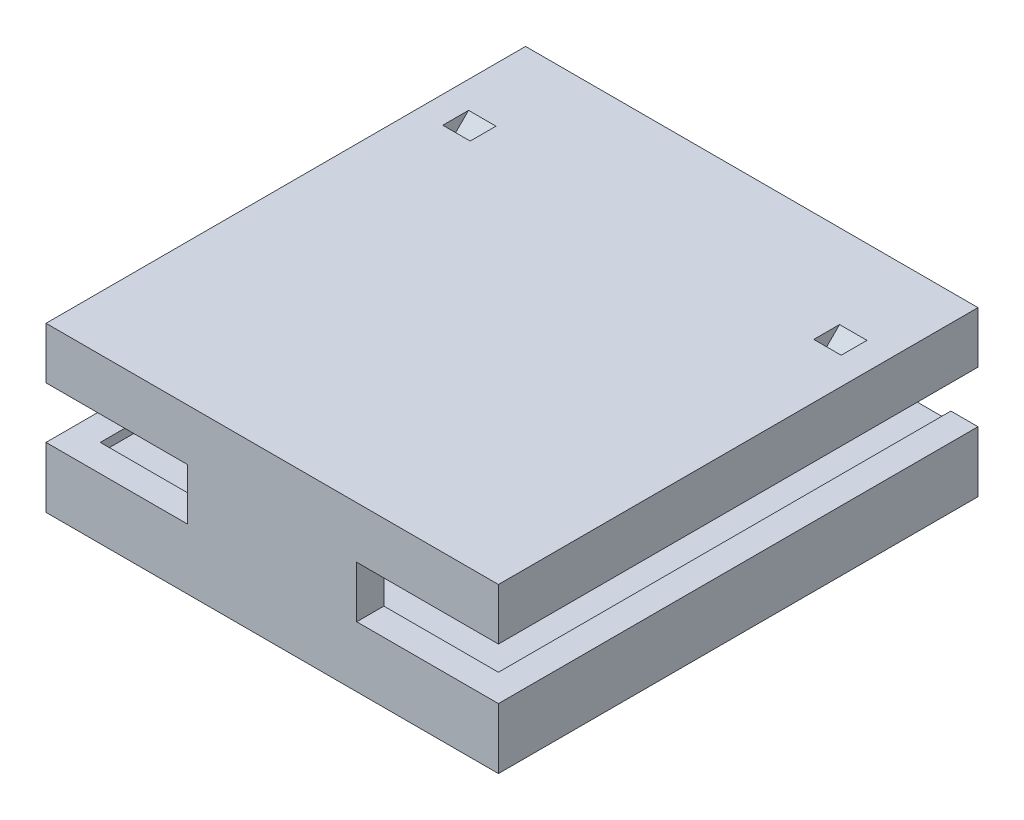
ISO-10303-21;
HEADER;
FILE_DESCRIPTION(('STEP AP214'),'2;1');
FILE_NAME('part.step','',(''),(''),'','','');
FILE_SCHEMA(('AUTOMOTIVE_DESIGN { 1 0 10303 214 1 1 1 1 }'));
ENDSEC;
DATA;
#1=APPLICATION_CONTEXT('core data for automotive mechanical design processes');
#2=APPLICATION_PROTOCOL_DEFINITION('international standard','automotive_design',2000,#1);
#3=PRODUCT_CONTEXT('',#1,'mechanical');
#4=PRODUCT('Part','Part','',(#3));
#5=PRODUCT_RELATED_PRODUCT_CATEGORY('part','',(#4));
#6=PRODUCT_DEFINITION_FORMATION('','',#4);
#7=PRODUCT_DEFINITION_CONTEXT('part definition',#1,'design');
#8=PRODUCT_DEFINITION('design','',#6,#7);
#9=PRODUCT_DEFINITION_SHAPE('','',#8);
#10=(LENGTH_UNIT() NAMED_UNIT(*) SI_UNIT(.MILLI.,.METRE.));
#11=(NAMED_UNIT(*) PLANE_ANGLE_UNIT() SI_UNIT($,.RADIAN.));
#12=(NAMED_UNIT(*) SI_UNIT($,.STERADIAN.) SOLID_ANGLE_UNIT());
#13=UNCERTAINTY_MEASURE_WITH_UNIT(LENGTH_MEASURE(1.E-05),#10,'distance_accuracy_value','');
#14=(GEOMETRIC_REPRESENTATION_CONTEXT(3) GLOBAL_UNCERTAINTY_ASSIGNED_CONTEXT((#13)) GLOBAL_UNIT_ASSIGNED_CONTEXT((#10,
#11,#12)) REPRESENTATION_CONTEXT('',''));
#15=CARTESIAN_POINT('',(0.,0.,0.));
#16=DIRECTION('',(0.,0.,1.));
#17=DIRECTION('',(1.,0.,0.));
#18=AXIS2_PLACEMENT_3D('',#15,#16,#17);
#19=CARTESIAN_POINT('',(0.,4.525,1.5));
#20=DIRECTION('',(0.,1.,0.));
#21=DIRECTION('',(0.,0.,1.));
#22=AXIS2_PLACEMENT_3D('',#19,#20,#21);
#23=PLANE('',#22);
#24=DIRECTION('',(0.,0.,-1.));
#25=VECTOR('',#24,1.);
#26=CARTESIAN_POINT('',(12.5,4.525,1.5));
#27=LINE('',#26,#25);
#28=CARTESIAN_POINT('',(12.5,4.525,1.5));
#29=VERTEX_POINT('',#28);
#30=CARTESIAN_POINT('',(12.5,4.525,-25.));
#31=VERTEX_POINT('',#30);
#32=EDGE_CURVE('E415',#29,#31,#27,.T.);
#33=ORIENTED_EDGE('',*,*,#32,.T.);
#34=DIRECTION('',(1.,0.,0.));
#35=VECTOR('',#34,1.);
#36=CARTESIAN_POINT('',(0.,4.525,-25.));
#37=LINE('',#36,#35);
#38=CARTESIAN_POINT('',(-12.5,4.525,-25.));
#39=VERTEX_POINT('',#38);
#40=EDGE_CURVE('E350',#39,#31,#37,.T.);
#41=ORIENTED_EDGE('',*,*,#40,.F.);
#42=DIRECTION('',(0.,0.,-1.));
#43=VECTOR('',#42,1.);
#44=CARTESIAN_POINT('',(-12.5,4.525,1.5));
#45=LINE('',#44,#43);
#46=CARTESIAN_POINT('',(-12.5,4.525,1.5));
#47=VERTEX_POINT('',#46);
#48=EDGE_CURVE('E413',#47,#39,#45,.T.);
#49=ORIENTED_EDGE('',*,*,#48,.F.);
#50=DIRECTION('',(1.,0.,0.));
#51=VECTOR('',#50,1.);
#52=CARTESIAN_POINT('',(0.,4.525,1.5));
#53=LINE('',#52,#51);
#54=EDGE_CURVE('E376',#47,#29,#53,.T.);
#55=ORIENTED_EDGE('',*,*,#54,.T.);
#56=EDGE_LOOP('',(#33,#41,#49,#55));
#57=FACE_BOUND('',#56,.T.);
#58=DIRECTION('',(0.,0.,1.));
#59=VECTOR('',#58,1.);
#60=CARTESIAN_POINT('',(-9.50000000000001,4.525,1.5));
#61=LINE('',#60,#59);
#62=CARTESIAN_POINT('',(-9.5,4.525,-20.3645));
#63=VERTEX_POINT('',#62);
#64=CARTESIAN_POINT('',(-9.5,4.525,-18.94));
#65=VERTEX_POINT('',#64);
#66=EDGE_CURVE('E297',#63,#65,#61,.T.);
#67=ORIENTED_EDGE('',*,*,#66,.T.);
#68=DIRECTION('',(-1.,0.,0.));
#69=VECTOR('',#68,1.);
#70=CARTESIAN_POINT('',(0.,4.525,-18.94));
#71=LINE('',#70,#69);
#72=CARTESIAN_POINT('',(-11.015,4.525,-18.94));
#73=VERTEX_POINT('',#72);
#74=EDGE_CURVE('E430',#65,#73,#71,.T.);
#75=ORIENTED_EDGE('',*,*,#74,.T.);
#76=DIRECTION('',(0.,0.,1.));
#77=VECTOR('',#76,1.);
#78=CARTESIAN_POINT('',(-11.015,4.525,1.5));
#79=LINE('',#78,#77);
#80=CARTESIAN_POINT('',(-11.015,4.525,-20.3645));
#81=VERTEX_POINT('',#80);
#82=EDGE_CURVE('E303',#81,#73,#79,.T.);
#83=ORIENTED_EDGE('',*,*,#82,.F.);
#84=DIRECTION('',(-1.,0.,0.));
#85=VECTOR('',#84,1.);
#86=CARTESIAN_POINT('',(0.,4.525,-20.3645));
#87=LINE('',#86,#85);
#88=EDGE_CURVE('E428',#63,#81,#87,.T.);
#89=ORIENTED_EDGE('',*,*,#88,.F.);
#90=EDGE_LOOP('',(#67,#75,#83,#89));
#91=FACE_BOUND('',#90,.T.);
#92=DIRECTION('',(0.,0.,1.));
#93=VECTOR('',#92,1.);
#94=CARTESIAN_POINT('',(11.,4.525,1.5));
#95=LINE('',#94,#93);
#96=CARTESIAN_POINT('',(11.,4.525,-20.3645));
#97=VERTEX_POINT('',#96);
#98=CARTESIAN_POINT('',(11.,4.525,-18.94));
#99=VERTEX_POINT('',#98);
#100=EDGE_CURVE('E259',#97,#99,#95,.T.);
#101=ORIENTED_EDGE('',*,*,#100,.T.);
#102=DIRECTION('',(-1.,0.,0.));
#103=VECTOR('',#102,1.);
#104=CARTESIAN_POINT('',(0.,4.525,-18.94));
#105=LINE('',#104,#103);
#106=CARTESIAN_POINT('',(9.485,4.525,-18.94));
#107=VERTEX_POINT('',#106);
#108=EDGE_CURVE('E11',#99,#107,#105,.T.);
#109=ORIENTED_EDGE('',*,*,#108,.T.);
#110=DIRECTION('',(0.,0.,1.));
#111=VECTOR('',#110,1.);
#112=CARTESIAN_POINT('',(9.48500000000001,4.525,1.5));
#113=LINE('',#112,#111);
#114=CARTESIAN_POINT('',(9.485,4.525,-20.3645));
#115=VERTEX_POINT('',#114);
#116=EDGE_CURVE('E263',#115,#107,#113,.T.);
#117=ORIENTED_EDGE('',*,*,#116,.F.);
#118=DIRECTION('',(-1.,0.,0.));
#119=VECTOR('',#118,1.);
#120=CARTESIAN_POINT('',(0.,4.525,-20.3645));
#121=LINE('',#120,#119);
#122=EDGE_CURVE('E42',#97,#115,#121,.T.);
#123=ORIENTED_EDGE('',*,*,#122,.F.);
#124=EDGE_LOOP('',(#101,#109,#117,#123));
#125=FACE_BOUND('',#124,.T.);
#126=ADVANCED_FACE('F34',(#57,#91,#125),#23,.T.);
#127=CARTESIAN_POINT('',(0.,-4.525,1.5));
#128=DIRECTION('',(0.,1.,0.));
#129=DIRECTION('',(0.,0.,1.));
#130=AXIS2_PLACEMENT_3D('',#127,#128,#129);
#131=PLANE('',#130);
#132=DIRECTION('',(-1.,0.,0.));
#133=VECTOR('',#132,1.);
#134=CARTESIAN_POINT('',(13.1425335469952,-4.52500000000001,-20.455));
#135=LINE('',#134,#133);
#136=CARTESIAN_POINT('',(11.,-4.52500000000001,-20.455));
#137=VERTEX_POINT('',#136);
#138=CARTESIAN_POINT('',(9.485,-4.525,-20.455));
#139=VERTEX_POINT('',#138);
#140=EDGE_CURVE('E235',#137,#139,#135,.T.);
#141=ORIENTED_EDGE('',*,*,#140,.T.);
#142=DIRECTION('',(0.,0.,1.));
#143=VECTOR('',#142,1.);
#144=CARTESIAN_POINT('',(9.485,-4.525,1.5));
#145=LINE('',#144,#143);
#146=CARTESIAN_POINT('',(9.485,-4.525,-18.94));
#147=VERTEX_POINT('',#146);
#148=EDGE_CURVE('E238',#139,#147,#145,.T.);
#149=ORIENTED_EDGE('',*,*,#148,.T.);
#150=DIRECTION('',(-1.,0.,0.));
#151=VECTOR('',#150,1.);
#152=CARTESIAN_POINT('',(0.,-4.525,-18.94));
#153=LINE('',#152,#151);
#154=CARTESIAN_POINT('',(11.,-4.525,-18.94));
#155=VERTEX_POINT('',#154);
#156=EDGE_CURVE('E227',#155,#147,#153,.T.);
#157=ORIENTED_EDGE('',*,*,#156,.F.);
#158=DIRECTION('',(0.,0.,1.));
#159=VECTOR('',#158,1.);
#160=CARTESIAN_POINT('',(11.,-4.525,1.5));
#161=LINE('',#160,#159);
#162=EDGE_CURVE('E257',#137,#155,#161,.T.);
#163=ORIENTED_EDGE('',*,*,#162,.F.);
#164=EDGE_LOOP('',(#141,#149,#157,#163));
#165=FACE_BOUND('',#164,.T.);
#166=DIRECTION('',(1.,0.,0.));
#167=VECTOR('',#166,1.);
#168=CARTESIAN_POINT('',(0.,-4.525,-25.));
#169=LINE('',#168,#167);
#170=CARTESIAN_POINT('',(-12.5,-4.525,-25.));
#171=VERTEX_POINT('',#170);
#172=CARTESIAN_POINT('',(12.5,-4.525,-25.));
#173=VERTEX_POINT('',#172);
#174=EDGE_CURVE('E316',#171,#173,#169,.T.);
#175=ORIENTED_EDGE('',*,*,#174,.T.);
#176=DIRECTION('',(0.,0.,-1.));
#177=VECTOR('',#176,1.);
#178=CARTESIAN_POINT('',(12.5,-4.525,1.5));
#179=LINE('',#178,#177);
#180=CARTESIAN_POINT('',(12.5,-4.525,1.5));
#181=VERTEX_POINT('',#180);
#182=EDGE_CURVE('E390',#181,#173,#179,.T.);
#183=ORIENTED_EDGE('',*,*,#182,.F.);
#184=DIRECTION('',(1.,0.,0.));
#185=VECTOR('',#184,1.);
#186=CARTESIAN_POINT('',(0.,-4.525,1.5));
#187=LINE('',#186,#185);
#188=CARTESIAN_POINT('',(-12.5,-4.525,1.5));
#189=VERTEX_POINT('',#188);
#190=EDGE_CURVE('E388',#189,#181,#187,.T.);
#191=ORIENTED_EDGE('',*,*,#190,.F.);
#192=DIRECTION('',(0.,0.,-1.));
#193=VECTOR('',#192,1.);
#194=CARTESIAN_POINT('',(-12.5,-4.525,1.5));
#195=LINE('',#194,#193);
#196=EDGE_CURVE('E401',#189,#171,#195,.T.);
#197=ORIENTED_EDGE('',*,*,#196,.T.);
#198=EDGE_LOOP('',(#175,#183,#191,#197));
#199=FACE_BOUND('',#198,.T.);
#200=DIRECTION('',(-1.,0.,0.));
#201=VECTOR('',#200,1.);
#202=CARTESIAN_POINT('',(-7.35746645300476,-4.52500000000001,-20.455));
#203=LINE('',#202,#201);
#204=CARTESIAN_POINT('',(-9.5,-4.52500000000001,-20.455));
#205=VERTEX_POINT('',#204);
#206=CARTESIAN_POINT('',(-11.015,-4.525,-20.455));
#207=VERTEX_POINT('',#206);
#208=EDGE_CURVE('E268',#205,#207,#203,.T.);
#209=ORIENTED_EDGE('',*,*,#208,.T.);
#210=DIRECTION('',(0.,0.,1.));
#211=VECTOR('',#210,1.);
#212=CARTESIAN_POINT('',(-11.015,-4.525,1.5));
#213=LINE('',#212,#211);
#214=CARTESIAN_POINT('',(-11.015,-4.525,-18.94));
#215=VERTEX_POINT('',#214);
#216=EDGE_CURVE('E300',#207,#215,#213,.T.);
#217=ORIENTED_EDGE('',*,*,#216,.T.);
#218=DIRECTION('',(-1.,0.,0.));
#219=VECTOR('',#218,1.);
#220=CARTESIAN_POINT('',(0.,-4.525,-18.94));
#221=LINE('',#220,#219);
#222=CARTESIAN_POINT('',(-9.5,-4.525,-18.94));
#223=VERTEX_POINT('',#222);
#224=EDGE_CURVE('E358',#223,#215,#221,.T.);
#225=ORIENTED_EDGE('',*,*,#224,.F.);
#226=DIRECTION('',(0.,0.,1.));
#227=VECTOR('',#226,1.);
#228=CARTESIAN_POINT('',(-9.50000000000001,-4.525,1.5));
#229=LINE('',#228,#227);
#230=EDGE_CURVE('E295',#205,#223,#229,.T.);
#231=ORIENTED_EDGE('',*,*,#230,.F.);
#232=EDGE_LOOP('',(#209,#217,#225,#231));
#233=FACE_BOUND('',#232,.T.);
#234=ADVANCED_FACE('F457',(#165,#199,#233),#131,.F.);
#235=CARTESIAN_POINT('',(12.5,0.,1.5));
#236=DIRECTION('',(1.,0.,0.));
#237=DIRECTION('',(0.,0.,-1.));
#238=AXIS2_PLACEMENT_3D('',#235,#236,#237);
#239=PLANE('',#238);
#240=ORIENTED_EDGE('',*,*,#182,.T.);
#241=DIRECTION('',(0.,-1.,0.));
#242=VECTOR('',#241,1.);
#243=CARTESIAN_POINT('',(12.5,0.,-25.));
#244=LINE('',#243,#242);
#245=CARTESIAN_POINT('',(12.5,-1.175,-25.));
#246=VERTEX_POINT('',#245);
#247=EDGE_CURVE('E318',#246,#173,#244,.T.);
#248=ORIENTED_EDGE('',*,*,#247,.F.);
#249=DIRECTION('',(0.,0.,-1.));
#250=VECTOR('',#249,1.);
#251=CARTESIAN_POINT('',(12.5,-1.175,1.5));
#252=LINE('',#251,#250);
#253=CARTESIAN_POINT('',(12.5,-1.175,1.5));
#254=VERTEX_POINT('',#253);
#255=EDGE_CURVE('E359',#254,#246,#252,.T.);
#256=ORIENTED_EDGE('',*,*,#255,.F.);
#257=DIRECTION('',(0.,-1.,0.));
#258=VECTOR('',#257,1.);
#259=CARTESIAN_POINT('',(12.5,0.,1.5));
#260=LINE('',#259,#258);
#261=EDGE_CURVE('E360',#254,#181,#260,.T.);
#262=ORIENTED_EDGE('',*,*,#261,.T.);
#263=EDGE_LOOP('',(#240,#248,#256,#262));
#264=FACE_BOUND('',#263,.T.);
#265=ADVANCED_FACE('F36',(#264),#239,.T.);
#266=CARTESIAN_POINT('',(0.,-1.175,1.5));
#267=DIRECTION('',(0.,1.,0.));
#268=DIRECTION('',(-1.,0.,0.));
#269=AXIS2_PLACEMENT_3D('',#266,#267,#268);
#270=PLANE('',#269);
#271=DIRECTION('',(1.,0.,0.));
#272=VECTOR('',#271,1.);
#273=CARTESIAN_POINT('',(0.,-1.175,0.));
#274=LINE('',#273,#272);
#275=CARTESIAN_POINT('',(4.67000000000001,-1.175,0.));
#276=VERTEX_POINT('',#275);
#277=CARTESIAN_POINT('',(11.,-1.175,0.));
#278=VERTEX_POINT('',#277);
#279=EDGE_CURVE('E355',#276,#278,#274,.T.);
#280=ORIENTED_EDGE('',*,*,#279,.F.);
#281=DIRECTION('',(0.,0.,-1.));
#282=VECTOR('',#281,1.);
#283=CARTESIAN_POINT('',(4.67000000000001,-1.175,1.5));
#284=LINE('',#283,#282);
#285=CARTESIAN_POINT('',(4.67000000000001,-1.175,1.5));
#286=VERTEX_POINT('',#285);
#287=EDGE_CURVE('E424',#286,#276,#284,.T.);
#288=ORIENTED_EDGE('',*,*,#287,.F.);
#289=DIRECTION('',(1.,0.,0.));
#290=VECTOR('',#289,1.);
#291=CARTESIAN_POINT('',(0.,-1.175,1.5));
#292=LINE('',#291,#290);
#293=EDGE_CURVE('E363',#286,#254,#292,.T.);
#294=ORIENTED_EDGE('',*,*,#293,.T.);
#295=ORIENTED_EDGE('',*,*,#255,.T.);
#296=DIRECTION('',(1.,0.,0.));
#297=VECTOR('',#296,1.);
#298=CARTESIAN_POINT('',(0.,-1.175,-25.));
#299=LINE('',#298,#297);
#300=CARTESIAN_POINT('',(11.,-1.175,-25.));
#301=VERTEX_POINT('',#300);
#302=EDGE_CURVE('E321',#301,#246,#299,.T.);
#303=ORIENTED_EDGE('',*,*,#302,.F.);
#304=DIRECTION('',(0.,0.,1.));
#305=VECTOR('',#304,1.);
#306=CARTESIAN_POINT('',(11.,-1.175,-25.));
#307=LINE('',#306,#305);
#308=EDGE_CURVE('E338',#301,#278,#307,.T.);
#309=ORIENTED_EDGE('',*,*,#308,.T.);
#310=EDGE_LOOP('',(#280,#288,#294,#295,#303,#309));
#311=FACE_BOUND('',#310,.T.);
#312=ADVANCED_FACE('F476',(#311),#270,.T.);
#313=CARTESIAN_POINT('',(4.67000000000001,0.,1.5));
#314=DIRECTION('',(1.,0.,0.));
#315=DIRECTION('',(0.,1.,0.));
#316=AXIS2_PLACEMENT_3D('',#313,#314,#315);
#317=PLANE('',#316);
#318=DIRECTION('',(0.,-1.,0.));
#319=VECTOR('',#318,1.);
#320=CARTESIAN_POINT('',(4.67000000000001,0.,0.));
#321=LINE('',#320,#319);
#322=CARTESIAN_POINT('',(4.67000000000001,1.675,0.));
#323=VERTEX_POINT('',#322);
#324=EDGE_CURVE('E392',#323,#276,#321,.T.);
#325=ORIENTED_EDGE('',*,*,#324,.F.);
#326=DIRECTION('',(0.,0.,-1.));
#327=VECTOR('',#326,1.);
#328=CARTESIAN_POINT('',(4.67000000000001,1.675,1.5));
#329=LINE('',#328,#327);
#330=CARTESIAN_POINT('',(4.67000000000001,1.675,1.5));
#331=VERTEX_POINT('',#330);
#332=EDGE_CURVE('E421',#331,#323,#329,.T.);
#333=ORIENTED_EDGE('',*,*,#332,.F.);
#334=DIRECTION('',(0.,-1.,0.));
#335=VECTOR('',#334,1.);
#336=CARTESIAN_POINT('',(4.67000000000001,0.,1.5));
#337=LINE('',#336,#335);
#338=EDGE_CURVE('E367',#331,#286,#337,.T.);
#339=ORIENTED_EDGE('',*,*,#338,.T.);
#340=ORIENTED_EDGE('',*,*,#287,.T.);
#341=EDGE_LOOP('',(#325,#333,#339,#340));
#342=FACE_BOUND('',#341,.T.);
#343=ADVANCED_FACE('F473',(#342),#317,.T.);
#344=CARTESIAN_POINT('',(12.5,0.,1.5));
#345=DIRECTION('',(1.,0.,0.));
#346=DIRECTION('',(0.,0.,-1.));
#347=AXIS2_PLACEMENT_3D('',#344,#345,#346);
#348=PLANE('',#347);
#349=DIRECTION('',(0.,0.,-1.));
#350=VECTOR('',#349,1.);
#351=CARTESIAN_POINT('',(12.5,1.675,1.5));
#352=LINE('',#351,#350);
#353=CARTESIAN_POINT('',(12.5,1.675,1.5));
#354=VERTEX_POINT('',#353);
#355=CARTESIAN_POINT('',(12.5,1.675,-25.));
#356=VERTEX_POINT('',#355);
#357=EDGE_CURVE('E418',#354,#356,#352,.T.);
#358=ORIENTED_EDGE('',*,*,#357,.T.);
#359=DIRECTION('',(0.,-1.,0.));
#360=VECTOR('',#359,1.);
#361=CARTESIAN_POINT('',(12.5,0.,-25.));
#362=LINE('',#361,#360);
#363=EDGE_CURVE('E347',#31,#356,#362,.T.);
#364=ORIENTED_EDGE('',*,*,#363,.F.);
#365=ORIENTED_EDGE('',*,*,#32,.F.);
#366=DIRECTION('',(0.,-1.,0.));
#367=VECTOR('',#366,1.);
#368=CARTESIAN_POINT('',(12.5,0.,1.5));
#369=LINE('',#368,#367);
#370=EDGE_CURVE('E372',#29,#354,#369,.T.);
#371=ORIENTED_EDGE('',*,*,#370,.T.);
#372=EDGE_LOOP('',(#358,#364,#365,#371));
#373=FACE_BOUND('',#372,.T.);
#374=ADVANCED_FACE('F470',(#373),#348,.T.);
#375=CARTESIAN_POINT('',(-12.5,0.,1.5));
#376=DIRECTION('',(1.,0.,0.));
#377=DIRECTION('',(0.,0.,-1.));
#378=AXIS2_PLACEMENT_3D('',#375,#376,#377);
#379=PLANE('',#378);
#380=ORIENTED_EDGE('',*,*,#48,.T.);
#381=DIRECTION('',(0.,-1.,0.));
#382=VECTOR('',#381,1.);
#383=CARTESIAN_POINT('',(-12.5,0.,-25.));
#384=LINE('',#383,#382);
#385=CARTESIAN_POINT('',(-12.5,1.675,-25.));
#386=VERTEX_POINT('',#385);
#387=EDGE_CURVE('E352',#39,#386,#384,.T.);
#388=ORIENTED_EDGE('',*,*,#387,.T.);
#389=DIRECTION('',(0.,0.,-1.));
#390=VECTOR('',#389,1.);
#391=CARTESIAN_POINT('',(-12.5,1.675,1.5));
#392=LINE('',#391,#390);
#393=CARTESIAN_POINT('',(-12.5,1.675,1.5));
#394=VERTEX_POINT('',#393);
#395=EDGE_CURVE('E411',#394,#386,#392,.T.);
#396=ORIENTED_EDGE('',*,*,#395,.F.);
#397=DIRECTION('',(0.,-1.,0.));
#398=VECTOR('',#397,1.);
#399=CARTESIAN_POINT('',(-12.5,0.,1.5));
#400=LINE('',#399,#398);
#401=EDGE_CURVE('E379',#47,#394,#400,.T.);
#402=ORIENTED_EDGE('',*,*,#401,.F.);
#403=EDGE_LOOP('',(#380,#388,#396,#402));
#404=FACE_BOUND('',#403,.T.);
#405=ADVANCED_FACE('F468',(#404),#379,.F.);
#406=CARTESIAN_POINT('',(0.,1.675,1.5));
#407=DIRECTION('',(0.,1.,0.));
#408=DIRECTION('',(0.,0.,1.));
#409=AXIS2_PLACEMENT_3D('',#406,#407,#408);
#410=PLANE('',#409);
#411=ORIENTED_EDGE('',*,*,#395,.T.);
#412=DIRECTION('',(1.,0.,0.));
#413=VECTOR('',#412,1.);
#414=CARTESIAN_POINT('',(0.,1.675,-25.));
#415=LINE('',#414,#413);
#416=EDGE_CURVE('E337',#386,#356,#415,.T.);
#417=ORIENTED_EDGE('',*,*,#416,.T.);
#418=ORIENTED_EDGE('',*,*,#357,.F.);
#419=DIRECTION('',(1.,0.,0.));
#420=VECTOR('',#419,1.);
#421=CARTESIAN_POINT('',(0.,1.675,1.5));
#422=LINE('',#421,#420);
#423=EDGE_CURVE('E370',#331,#354,#422,.T.);
#424=ORIENTED_EDGE('',*,*,#423,.F.);
#425=ORIENTED_EDGE('',*,*,#332,.T.);
#426=DIRECTION('',(1.,0.,0.));
#427=VECTOR('',#426,1.);
#428=CARTESIAN_POINT('',(0.,1.675,0.));
#429=LINE('',#428,#427);
#430=CARTESIAN_POINT('',(-4.66999999999999,1.675,0.));
#431=VERTEX_POINT('',#430);
#432=EDGE_CURVE('E356',#431,#323,#429,.T.);
#433=ORIENTED_EDGE('',*,*,#432,.F.);
#434=DIRECTION('',(0.,0.,-1.));
#435=VECTOR('',#434,1.);
#436=CARTESIAN_POINT('',(-4.66999999999999,1.675,1.5));
#437=LINE('',#436,#435);
#438=CARTESIAN_POINT('',(-4.66999999999999,1.675,1.5));
#439=VERTEX_POINT('',#438);
#440=EDGE_CURVE('E408',#439,#431,#437,.T.);
#441=ORIENTED_EDGE('',*,*,#440,.F.);
#442=EDGE_CURVE('E373',#394,#439,#422,.T.);
#443=ORIENTED_EDGE('',*,*,#442,.F.);
#444=EDGE_LOOP('',(#411,#417,#418,#424,#425,#433,#441,#443));
#445=FACE_BOUND('',#444,.T.);
#446=ADVANCED_FACE('F536',(#445),#410,.F.);
#447=CARTESIAN_POINT('',(-4.66999999999999,0.,1.5));
#448=DIRECTION('',(1.,0.,0.));
#449=DIRECTION('',(0.,0.,-1.));
#450=AXIS2_PLACEMENT_3D('',#447,#448,#449);
#451=PLANE('',#450);
#452=DIRECTION('',(0.,-1.,0.));
#453=VECTOR('',#452,1.);
#454=CARTESIAN_POINT('',(-4.66999999999999,0.,0.));
#455=LINE('',#454,#453);
#456=CARTESIAN_POINT('',(-4.66999999999999,-1.175,0.));
#457=VERTEX_POINT('',#456);
#458=EDGE_CURVE('E395',#431,#457,#455,.T.);
#459=ORIENTED_EDGE('',*,*,#458,.T.);
#460=DIRECTION('',(0.,0.,-1.));
#461=VECTOR('',#460,1.);
#462=CARTESIAN_POINT('',(-4.66999999999999,-1.175,1.5));
#463=LINE('',#462,#461);
#464=CARTESIAN_POINT('',(-4.66999999999999,-1.175,1.5));
#465=VERTEX_POINT('',#464);
#466=EDGE_CURVE('E405',#465,#457,#463,.T.);
#467=ORIENTED_EDGE('',*,*,#466,.F.);
#468=DIRECTION('',(0.,-1.,0.));
#469=VECTOR('',#468,1.);
#470=CARTESIAN_POINT('',(-4.66999999999999,0.,1.5));
#471=LINE('',#470,#469);
#472=EDGE_CURVE('E381',#439,#465,#471,.T.);
#473=ORIENTED_EDGE('',*,*,#472,.F.);
#474=ORIENTED_EDGE('',*,*,#440,.T.);
#475=EDGE_LOOP('',(#459,#467,#473,#474));
#476=FACE_BOUND('',#475,.T.);
#477=ADVANCED_FACE('F532',(#476),#451,.F.);
#478=CARTESIAN_POINT('',(0.,-1.175,1.5));
#479=DIRECTION('',(0.,1.,0.));
#480=DIRECTION('',(0.,0.,1.));
#481=AXIS2_PLACEMENT_3D('',#478,#479,#480);
#482=PLANE('',#481);
#483=DIRECTION('',(1.,0.,0.));
#484=VECTOR('',#483,1.);
#485=CARTESIAN_POINT('',(0.,-1.175,0.));
#486=LINE('',#485,#484);
#487=CARTESIAN_POINT('',(-11.,-1.175,0.));
#488=VERTEX_POINT('',#487);
#489=EDGE_CURVE('E364',#488,#457,#486,.T.);
#490=ORIENTED_EDGE('',*,*,#489,.F.);
#491=DIRECTION('',(0.,0.,1.));
#492=VECTOR('',#491,1.);
#493=CARTESIAN_POINT('',(-11.,-1.175,-25.));
#494=LINE('',#493,#492);
#495=CARTESIAN_POINT('',(-11.,-1.175,-25.));
#496=VERTEX_POINT('',#495);
#497=EDGE_CURVE('E341',#496,#488,#494,.T.);
#498=ORIENTED_EDGE('',*,*,#497,.F.);
#499=DIRECTION('',(1.,0.,0.));
#500=VECTOR('',#499,1.);
#501=CARTESIAN_POINT('',(0.,-1.175,-25.));
#502=LINE('',#501,#500);
#503=CARTESIAN_POINT('',(-12.5,-1.175,-25.));
#504=VERTEX_POINT('',#503);
#505=EDGE_CURVE('E311',#504,#496,#502,.T.);
#506=ORIENTED_EDGE('',*,*,#505,.F.);
#507=DIRECTION('',(0.,0.,-1.));
#508=VECTOR('',#507,1.);
#509=CARTESIAN_POINT('',(-12.5,-1.175,1.5));
#510=LINE('',#509,#508);
#511=CARTESIAN_POINT('',(-12.5,-1.175,1.5));
#512=VERTEX_POINT('',#511);
#513=EDGE_CURVE('E403',#512,#504,#510,.T.);
#514=ORIENTED_EDGE('',*,*,#513,.F.);
#515=DIRECTION('',(1.,0.,0.));
#516=VECTOR('',#515,1.);
#517=CARTESIAN_POINT('',(0.,-1.175,1.5));
#518=LINE('',#517,#516);
#519=EDGE_CURVE('E383',#512,#465,#518,.T.);
#520=ORIENTED_EDGE('',*,*,#519,.T.);
#521=ORIENTED_EDGE('',*,*,#466,.T.);
#522=EDGE_LOOP('',(#490,#498,#506,#514,#520,#521));
#523=FACE_BOUND('',#522,.T.);
#524=ADVANCED_FACE('F518',(#523),#482,.T.);
#525=CARTESIAN_POINT('',(-12.5,0.,1.5));
#526=DIRECTION('',(1.,0.,0.));
#527=DIRECTION('',(0.,0.,-1.));
#528=AXIS2_PLACEMENT_3D('',#525,#526,#527);
#529=PLANE('',#528);
#530=ORIENTED_EDGE('',*,*,#513,.T.);
#531=DIRECTION('',(0.,-1.,0.));
#532=VECTOR('',#531,1.);
#533=CARTESIAN_POINT('',(-12.5,0.,-25.));
#534=LINE('',#533,#532);
#535=EDGE_CURVE('E313',#504,#171,#534,.T.);
#536=ORIENTED_EDGE('',*,*,#535,.T.);
#537=ORIENTED_EDGE('',*,*,#196,.F.);
#538=DIRECTION('',(0.,-1.,0.));
#539=VECTOR('',#538,1.);
#540=CARTESIAN_POINT('',(-12.5,0.,1.5));
#541=LINE('',#540,#539);
#542=EDGE_CURVE('E386',#512,#189,#541,.T.);
#543=ORIENTED_EDGE('',*,*,#542,.F.);
#544=EDGE_LOOP('',(#530,#536,#537,#543));
#545=FACE_BOUND('',#544,.T.);
#546=ADVANCED_FACE('F511',(#545),#529,.F.);
#547=CARTESIAN_POINT('',(0.,0.,1.5));
#548=DIRECTION('',(0.,0.,1.));
#549=DIRECTION('',(1.,0.,0.));
#550=AXIS2_PLACEMENT_3D('',#547,#548,#549);
#551=PLANE('',#550);
#552=ORIENTED_EDGE('',*,*,#261,.F.);
#553=ORIENTED_EDGE('',*,*,#293,.F.);
#554=ORIENTED_EDGE('',*,*,#338,.F.);
#555=ORIENTED_EDGE('',*,*,#423,.T.);
#556=ORIENTED_EDGE('',*,*,#370,.F.);
#557=ORIENTED_EDGE('',*,*,#54,.F.);
#558=ORIENTED_EDGE('',*,*,#401,.T.);
#559=ORIENTED_EDGE('',*,*,#442,.T.);
#560=ORIENTED_EDGE('',*,*,#472,.T.);
#561=ORIENTED_EDGE('',*,*,#519,.F.);
#562=ORIENTED_EDGE('',*,*,#542,.T.);
#563=ORIENTED_EDGE('',*,*,#190,.T.);
#564=EDGE_LOOP('',(#552,#553,#554,#555,#556,#557,#558,#559,#560,#561,#562,#563));
#565=FACE_BOUND('',#564,.T.);
#566=ADVANCED_FACE('F496',(#565),#551,.T.);
#567=CARTESIAN_POINT('',(0.,0.,0.));
#568=DIRECTION('',(0.,0.,1.));
#569=DIRECTION('',(1.,0.,0.));
#570=AXIS2_PLACEMENT_3D('',#567,#568,#569);
#571=PLANE('',#570);
#572=ORIENTED_EDGE('',*,*,#279,.T.);
#573=DIRECTION('',(0.,-1.,0.));
#574=VECTOR('',#573,1.);
#575=CARTESIAN_POINT('',(11.,0.,0.));
#576=LINE('',#575,#574);
#577=CARTESIAN_POINT('',(11.,-1.675,0.));
#578=VERTEX_POINT('',#577);
#579=EDGE_CURVE('E309',#278,#578,#576,.T.);
#580=ORIENTED_EDGE('',*,*,#579,.T.);
#581=DIRECTION('',(1.,0.,0.));
#582=VECTOR('',#581,1.);
#583=CARTESIAN_POINT('',(0.,-1.675,0.));
#584=LINE('',#583,#582);
#585=CARTESIAN_POINT('',(-11.,-1.675,0.));
#586=VERTEX_POINT('',#585);
#587=EDGE_CURVE('E305',#586,#578,#584,.T.);
#588=ORIENTED_EDGE('',*,*,#587,.F.);
#589=DIRECTION('',(0.,-1.,0.));
#590=VECTOR('',#589,1.);
#591=CARTESIAN_POINT('',(-11.,0.,0.));
#592=LINE('',#591,#590);
#593=EDGE_CURVE('E330',#488,#586,#592,.T.);
#594=ORIENTED_EDGE('',*,*,#593,.F.);
#595=ORIENTED_EDGE('',*,*,#489,.T.);
#596=ORIENTED_EDGE('',*,*,#458,.F.);
#597=ORIENTED_EDGE('',*,*,#432,.T.);
#598=ORIENTED_EDGE('',*,*,#324,.T.);
#599=EDGE_LOOP('',(#572,#580,#588,#594,#595,#596,#597,#598));
#600=FACE_BOUND('',#599,.T.);
#601=ADVANCED_FACE('F490',(#600),#571,.F.);
#602=CARTESIAN_POINT('',(0.,0.,-25.));
#603=DIRECTION('',(0.,0.,1.));
#604=DIRECTION('',(1.,0.,0.));
#605=AXIS2_PLACEMENT_3D('',#602,#603,#604);
#606=PLANE('',#605);
#607=ORIENTED_EDGE('',*,*,#40,.T.);
#608=ORIENTED_EDGE('',*,*,#363,.T.);
#609=ORIENTED_EDGE('',*,*,#416,.F.);
#610=ORIENTED_EDGE('',*,*,#387,.F.);
#611=EDGE_LOOP('',(#607,#608,#609,#610));
#612=FACE_BOUND('',#611,.T.);
#613=ADVANCED_FACE('F546',(#612),#606,.F.);
#614=CARTESIAN_POINT('',(0.,-1.675,-25.));
#615=DIRECTION('',(0.,-1.,0.));
#616=DIRECTION('',(0.,0.,-1.));
#617=AXIS2_PLACEMENT_3D('',#614,#615,#616);
#618=PLANE('',#617);
#619=ORIENTED_EDGE('',*,*,#587,.T.);
#620=DIRECTION('',(0.,0.,1.));
#621=VECTOR('',#620,1.);
#622=CARTESIAN_POINT('',(11.,-1.675,-25.));
#623=LINE('',#622,#621);
#624=CARTESIAN_POINT('',(11.,-1.675,-25.));
#625=VERTEX_POINT('',#624);
#626=EDGE_CURVE('E334',#625,#578,#623,.T.);
#627=ORIENTED_EDGE('',*,*,#626,.F.);
#628=DIRECTION('',(1.,0.,0.));
#629=VECTOR('',#628,1.);
#630=CARTESIAN_POINT('',(0.,-1.675,-25.));
#631=LINE('',#630,#629);
#632=CARTESIAN_POINT('',(-11.,-1.675,-25.));
#633=VERTEX_POINT('',#632);
#634=EDGE_CURVE('E306',#633,#625,#631,.T.);
#635=ORIENTED_EDGE('',*,*,#634,.F.);
#636=DIRECTION('',(0.,0.,1.));
#637=VECTOR('',#636,1.);
#638=CARTESIAN_POINT('',(-11.,-1.675,-25.));
#639=LINE('',#638,#637);
#640=EDGE_CURVE('E327',#633,#586,#639,.T.);
#641=ORIENTED_EDGE('',*,*,#640,.T.);
#642=EDGE_LOOP('',(#619,#627,#635,#641));
#643=FACE_BOUND('',#642,.T.);
#644=ADVANCED_FACE('F526',(#643),#618,.F.);
#645=CARTESIAN_POINT('',(11.,0.,-25.));
#646=DIRECTION('',(-1.,0.,0.));
#647=DIRECTION('',(0.,0.,1.));
#648=AXIS2_PLACEMENT_3D('',#645,#646,#647);
#649=PLANE('',#648);
#650=ORIENTED_EDGE('',*,*,#579,.F.);
#651=ORIENTED_EDGE('',*,*,#308,.F.);
#652=DIRECTION('',(0.,-1.,0.));
#653=VECTOR('',#652,1.);
#654=CARTESIAN_POINT('',(11.,0.,-25.));
#655=LINE('',#654,#653);
#656=EDGE_CURVE('E324',#301,#625,#655,.T.);
#657=ORIENTED_EDGE('',*,*,#656,.T.);
#658=ORIENTED_EDGE('',*,*,#626,.T.);
#659=EDGE_LOOP('',(#650,#651,#657,#658));
#660=FACE_BOUND('',#659,.T.);
#661=ADVANCED_FACE('F528',(#660),#649,.T.);
#662=CARTESIAN_POINT('',(-11.,0.,-25.));
#663=DIRECTION('',(-1.,0.,0.));
#664=DIRECTION('',(0.,0.,1.));
#665=AXIS2_PLACEMENT_3D('',#662,#663,#664);
#666=PLANE('',#665);
#667=ORIENTED_EDGE('',*,*,#593,.T.);
#668=ORIENTED_EDGE('',*,*,#640,.F.);
#669=DIRECTION('',(0.,-1.,0.));
#670=VECTOR('',#669,1.);
#671=CARTESIAN_POINT('',(-11.,0.,-25.));
#672=LINE('',#671,#670);
#673=EDGE_CURVE('E308',#496,#633,#672,.T.);
#674=ORIENTED_EDGE('',*,*,#673,.F.);
#675=ORIENTED_EDGE('',*,*,#497,.T.);
#676=EDGE_LOOP('',(#667,#668,#674,#675));
#677=FACE_BOUND('',#676,.T.);
#678=ADVANCED_FACE('F524',(#677),#666,.F.);
#679=CARTESIAN_POINT('',(0.,0.,-25.));
#680=DIRECTION('',(0.,0.,1.));
#681=DIRECTION('',(1.,0.,0.));
#682=AXIS2_PLACEMENT_3D('',#679,#680,#681);
#683=PLANE('',#682);
#684=ORIENTED_EDGE('',*,*,#634,.T.);
#685=ORIENTED_EDGE('',*,*,#656,.F.);
#686=ORIENTED_EDGE('',*,*,#302,.T.);
#687=ORIENTED_EDGE('',*,*,#247,.T.);
#688=ORIENTED_EDGE('',*,*,#174,.F.);
#689=ORIENTED_EDGE('',*,*,#535,.F.);
#690=ORIENTED_EDGE('',*,*,#505,.T.);
#691=ORIENTED_EDGE('',*,*,#673,.T.);
#692=EDGE_LOOP('',(#684,#685,#686,#687,#688,#689,#690,#691));
#693=FACE_BOUND('',#692,.T.);
#694=ADVANCED_FACE('F502',(#693),#683,.F.);
#695=CARTESIAN_POINT('',(-7.35746645300476,-3.01000000000001,-18.94));
#696=DIRECTION('',(0.,0.707106781186547,-0.707106781186548));
#697=DIRECTION('',(0.,-0.707106781186548,-0.707106781186547));
#698=AXIS2_PLACEMENT_3D('',#695,#696,#697);
#699=PLANE('',#698);
#700=DIRECTION('',(0.,0.707106781186548,0.707106781186547));
#701=VECTOR('',#700,1.);
#702=CARTESIAN_POINT('',(-9.5,-3.01,-18.94));
#703=LINE('',#702,#701);
#704=CARTESIAN_POINT('',(-9.5,-3.01000000000001,-18.94));
#705=VERTEX_POINT('',#704);
#706=EDGE_CURVE('E271',#205,#705,#703,.T.);
#707=ORIENTED_EDGE('',*,*,#706,.T.);
#708=DIRECTION('',(-1.,0.,0.));
#709=VECTOR('',#708,1.);
#710=CARTESIAN_POINT('',(-7.35746645300476,-3.01000000000001,-18.94));
#711=LINE('',#710,#709);
#712=CARTESIAN_POINT('',(-11.015,-3.01,-18.94));
#713=VERTEX_POINT('',#712);
#714=EDGE_CURVE('E267',#705,#713,#711,.T.);
#715=ORIENTED_EDGE('',*,*,#714,.T.);
#716=DIRECTION('',(0.,-0.707106781186548,-0.707106781186547));
#717=VECTOR('',#716,1.);
#718=CARTESIAN_POINT('',(-11.015,-3.01,-18.94));
#719=LINE('',#718,#717);
#720=EDGE_CURVE('E265',#713,#207,#719,.T.);
#721=ORIENTED_EDGE('',*,*,#720,.T.);
#722=ORIENTED_EDGE('',*,*,#208,.F.);
#723=EDGE_LOOP('',(#707,#715,#721,#722));
#724=FACE_BOUND('',#723,.T.);
#725=ADVANCED_FACE('F675',(#724),#699,.F.);
#726=CARTESIAN_POINT('',(-9.5,-4.525,-18.94));
#727=DIRECTION('',(0.,0.,-1.));
#728=DIRECTION('',(-1.,0.,0.));
#729=AXIS2_PLACEMENT_3D('',#726,#727,#728);
#730=PLANE('',#729);
#731=ORIENTED_EDGE('',*,*,#224,.T.);
#732=DIRECTION('',(0.,-1.,0.));
#733=VECTOR('',#732,1.);
#734=CARTESIAN_POINT('',(-11.015,-4.525,-18.94));
#735=LINE('',#734,#733);
#736=EDGE_CURVE('E279',#713,#215,#735,.T.);
#737=ORIENTED_EDGE('',*,*,#736,.F.);
#738=ORIENTED_EDGE('',*,*,#714,.F.);
#739=DIRECTION('',(0.,-1.,0.));
#740=VECTOR('',#739,1.);
#741=CARTESIAN_POINT('',(-9.5,-4.525,-18.94));
#742=LINE('',#741,#740);
#743=EDGE_CURVE('E286',#705,#223,#742,.T.);
#744=ORIENTED_EDGE('',*,*,#743,.T.);
#745=EDGE_LOOP('',(#731,#737,#738,#744));
#746=FACE_BOUND('',#745,.T.);
#747=ADVANCED_FACE('F684',(#746),#730,.T.);
#748=CARTESIAN_POINT('',(-9.5,-4.525,-26.515));
#749=DIRECTION('',(-1.,0.,0.));
#750=DIRECTION('',(0.,1.,0.));
#751=AXIS2_PLACEMENT_3D('',#748,#749,#750);
#752=PLANE('',#751);
#753=ORIENTED_EDGE('',*,*,#230,.T.);
#754=ORIENTED_EDGE('',*,*,#743,.F.);
#755=ORIENTED_EDGE('',*,*,#706,.F.);
#756=EDGE_LOOP('',(#753,#754,#755));
#757=FACE_BOUND('',#756,.T.);
#758=ADVANCED_FACE('F695',(#757),#752,.T.);
#759=CARTESIAN_POINT('',(-11.015,-4.525,-26.515));
#760=DIRECTION('',(-1.,0.,0.));
#761=DIRECTION('',(0.,0.,1.));
#762=AXIS2_PLACEMENT_3D('',#759,#760,#761);
#763=PLANE('',#762);
#764=ORIENTED_EDGE('',*,*,#720,.F.);
#765=ORIENTED_EDGE('',*,*,#736,.T.);
#766=ORIENTED_EDGE('',*,*,#216,.F.);
#767=EDGE_LOOP('',(#764,#765,#766));
#768=FACE_BOUND('',#767,.T.);
#769=ADVANCED_FACE('F706',(#768),#763,.F.);
#770=ORIENTED_EDGE('',*,*,#82,.T.);
#771=DIRECTION('',(0.,1.,0.));
#772=VECTOR('',#771,1.);
#773=CARTESIAN_POINT('',(-11.015,-4.525,-18.94));
#774=LINE('',#773,#772);
#775=CARTESIAN_POINT('',(-11.015,3.1005,-18.94));
#776=VERTEX_POINT('',#775);
#777=EDGE_CURVE('E289',#776,#73,#774,.T.);
#778=ORIENTED_EDGE('',*,*,#777,.F.);
#779=DIRECTION('',(0.,-0.707106781186547,0.707106781186548));
#780=VECTOR('',#779,1.);
#781=CARTESIAN_POINT('',(-11.015,4.6155,-20.455));
#782=LINE('',#781,#780);
#783=EDGE_CURVE('E276',#81,#776,#782,.T.);
#784=ORIENTED_EDGE('',*,*,#783,.F.);
#785=EDGE_LOOP('',(#770,#778,#784));
#786=FACE_BOUND('',#785,.T.);
#787=ADVANCED_FACE('F719',(#786),#763,.F.);
#788=DIRECTION('',(0.,0.707106781186547,-0.707106781186548));
#789=VECTOR('',#788,1.);
#790=CARTESIAN_POINT('',(-9.5,4.6155,-20.455));
#791=LINE('',#790,#789);
#792=CARTESIAN_POINT('',(-9.5,3.1005,-18.94));
#793=VERTEX_POINT('',#792);
#794=EDGE_CURVE('E277',#793,#63,#791,.T.);
#795=ORIENTED_EDGE('',*,*,#794,.F.);
#796=DIRECTION('',(0.,1.,0.));
#797=VECTOR('',#796,1.);
#798=CARTESIAN_POINT('',(-9.5,-4.525,-18.94));
#799=LINE('',#798,#797);
#800=EDGE_CURVE('E292',#793,#65,#799,.T.);
#801=ORIENTED_EDGE('',*,*,#800,.T.);
#802=ORIENTED_EDGE('',*,*,#66,.F.);
#803=EDGE_LOOP('',(#795,#801,#802));
#804=FACE_BOUND('',#803,.T.);
#805=ADVANCED_FACE('F709',(#804),#752,.T.);
#806=CARTESIAN_POINT('',(-9.5,-4.525,-18.94));
#807=DIRECTION('',(0.,0.,-1.));
#808=DIRECTION('',(-1.,0.,0.));
#809=AXIS2_PLACEMENT_3D('',#806,#807,#808);
#810=PLANE('',#809);
#811=ORIENTED_EDGE('',*,*,#800,.F.);
#812=DIRECTION('',(-1.,0.,0.));
#813=VECTOR('',#812,1.);
#814=CARTESIAN_POINT('',(-7.35746645300476,3.1005,-18.94));
#815=LINE('',#814,#813);
#816=EDGE_CURVE('E280',#793,#776,#815,.T.);
#817=ORIENTED_EDGE('',*,*,#816,.T.);
#818=ORIENTED_EDGE('',*,*,#777,.T.);
#819=ORIENTED_EDGE('',*,*,#74,.F.);
#820=EDGE_LOOP('',(#811,#817,#818,#819));
#821=FACE_BOUND('',#820,.T.);
#822=ADVANCED_FACE('F741',(#821),#810,.T.);
#823=CARTESIAN_POINT('',(-7.35746645300476,4.6155,-20.455));
#824=DIRECTION('',(0.,-0.707106781186548,-0.707106781186547));
#825=DIRECTION('',(0.,-0.707106781186547,0.707106781186548));
#826=AXIS2_PLACEMENT_3D('',#823,#824,#825);
#827=PLANE('',#826);
#828=ORIENTED_EDGE('',*,*,#88,.T.);
#829=ORIENTED_EDGE('',*,*,#783,.T.);
#830=ORIENTED_EDGE('',*,*,#816,.F.);
#831=ORIENTED_EDGE('',*,*,#794,.T.);
#832=EDGE_LOOP('',(#828,#829,#830,#831));
#833=FACE_BOUND('',#832,.T.);
#834=ADVANCED_FACE('F752',(#833),#827,.F.);
#835=CARTESIAN_POINT('',(13.1425335469952,-3.01000000000001,-18.94));
#836=DIRECTION('',(0.,0.707106781186547,-0.707106781186548));
#837=DIRECTION('',(0.,-0.707106781186548,-0.707106781186547));
#838=AXIS2_PLACEMENT_3D('',#835,#836,#837);
#839=PLANE('',#838);
#840=DIRECTION('',(0.,0.707106781186548,0.707106781186547));
#841=VECTOR('',#840,1.);
#842=CARTESIAN_POINT('',(11.,-3.01,-18.94));
#843=LINE('',#842,#841);
#844=CARTESIAN_POINT('',(11.,-3.01,-18.94));
#845=VERTEX_POINT('',#844);
#846=EDGE_CURVE('E234',#137,#845,#843,.T.);
#847=ORIENTED_EDGE('',*,*,#846,.T.);
#848=DIRECTION('',(-1.,0.,0.));
#849=VECTOR('',#848,1.);
#850=CARTESIAN_POINT('',(13.1425335469952,-3.01000000000001,-18.94));
#851=LINE('',#850,#849);
#852=CARTESIAN_POINT('',(9.485,-3.01,-18.94));
#853=VERTEX_POINT('',#852);
#854=EDGE_CURVE('E225',#845,#853,#851,.T.);
#855=ORIENTED_EDGE('',*,*,#854,.T.);
#856=DIRECTION('',(0.,-0.707106781186548,-0.707106781186547));
#857=VECTOR('',#856,1.);
#858=CARTESIAN_POINT('',(9.485,-3.01,-18.94));
#859=LINE('',#858,#857);
#860=EDGE_CURVE('E57',#853,#139,#859,.T.);
#861=ORIENTED_EDGE('',*,*,#860,.T.);
#862=ORIENTED_EDGE('',*,*,#140,.F.);
#863=EDGE_LOOP('',(#847,#855,#861,#862));
#864=FACE_BOUND('',#863,.T.);
#865=ADVANCED_FACE('F233',(#864),#839,.F.);
#866=CARTESIAN_POINT('',(11.,-4.525,-18.94));
#867=DIRECTION('',(0.,0.,-1.));
#868=DIRECTION('',(-1.,0.,0.));
#869=AXIS2_PLACEMENT_3D('',#866,#867,#868);
#870=PLANE('',#869);
#871=ORIENTED_EDGE('',*,*,#156,.T.);
#872=DIRECTION('',(0.,-1.,0.));
#873=VECTOR('',#872,1.);
#874=CARTESIAN_POINT('',(9.485,-4.525,-18.94));
#875=LINE('',#874,#873);
#876=EDGE_CURVE('E222',#853,#147,#875,.T.);
#877=ORIENTED_EDGE('',*,*,#876,.F.);
#878=ORIENTED_EDGE('',*,*,#854,.F.);
#879=DIRECTION('',(0.,-1.,0.));
#880=VECTOR('',#879,1.);
#881=CARTESIAN_POINT('',(11.,-4.525,-18.94));
#882=LINE('',#881,#880);
#883=EDGE_CURVE('E230',#845,#155,#882,.T.);
#884=ORIENTED_EDGE('',*,*,#883,.T.);
#885=EDGE_LOOP('',(#871,#877,#878,#884));
#886=FACE_BOUND('',#885,.T.);
#887=ADVANCED_FACE('F223',(#886),#870,.T.);
#888=CARTESIAN_POINT('',(11.,-4.525,-26.515));
#889=DIRECTION('',(-1.,0.,0.));
#890=DIRECTION('',(0.,1.,0.));
#891=AXIS2_PLACEMENT_3D('',#888,#889,#890);
#892=PLANE('',#891);
#893=ORIENTED_EDGE('',*,*,#162,.T.);
#894=ORIENTED_EDGE('',*,*,#883,.F.);
#895=ORIENTED_EDGE('',*,*,#846,.F.);
#896=EDGE_LOOP('',(#893,#894,#895));
#897=FACE_BOUND('',#896,.T.);
#898=ADVANCED_FACE('F447',(#897),#892,.T.);
#899=CARTESIAN_POINT('',(9.485,-4.525,-26.515));
#900=DIRECTION('',(-1.,0.,0.));
#901=DIRECTION('',(0.,0.,1.));
#902=AXIS2_PLACEMENT_3D('',#899,#900,#901);
#903=PLANE('',#902);
#904=ORIENTED_EDGE('',*,*,#860,.F.);
#905=ORIENTED_EDGE('',*,*,#876,.T.);
#906=ORIENTED_EDGE('',*,*,#148,.F.);
#907=EDGE_LOOP('',(#904,#905,#906));
#908=FACE_BOUND('',#907,.T.);
#909=ADVANCED_FACE('F237',(#908),#903,.F.);
#910=ORIENTED_EDGE('',*,*,#116,.T.);
#911=DIRECTION('',(0.,1.,0.));
#912=VECTOR('',#911,1.);
#913=CARTESIAN_POINT('',(9.485,-4.525,-18.94));
#914=LINE('',#913,#912);
#915=CARTESIAN_POINT('',(9.485,3.1005,-18.94));
#916=VERTEX_POINT('',#915);
#917=EDGE_CURVE('E251',#916,#107,#914,.T.);
#918=ORIENTED_EDGE('',*,*,#917,.F.);
#919=DIRECTION('',(0.,-0.707106781186547,0.707106781186548));
#920=VECTOR('',#919,1.);
#921=CARTESIAN_POINT('',(9.485,4.6155,-20.455));
#922=LINE('',#921,#920);
#923=EDGE_CURVE('E244',#115,#916,#922,.T.);
#924=ORIENTED_EDGE('',*,*,#923,.F.);
#925=EDGE_LOOP('',(#910,#918,#924));
#926=FACE_BOUND('',#925,.T.);
#927=ADVANCED_FACE('F440',(#926),#903,.F.);
#928=DIRECTION('',(0.,0.707106781186547,-0.707106781186548));
#929=VECTOR('',#928,1.);
#930=CARTESIAN_POINT('',(11.,4.6155,-20.455));
#931=LINE('',#930,#929);
#932=CARTESIAN_POINT('',(11.,3.1005,-18.94));
#933=VERTEX_POINT('',#932);
#934=EDGE_CURVE('E49',#933,#97,#931,.T.);
#935=ORIENTED_EDGE('',*,*,#934,.F.);
#936=DIRECTION('',(0.,1.,0.));
#937=VECTOR('',#936,1.);
#938=CARTESIAN_POINT('',(11.,-4.525,-18.94));
#939=LINE('',#938,#937);
#940=EDGE_CURVE('E254',#933,#99,#939,.T.);
#941=ORIENTED_EDGE('',*,*,#940,.T.);
#942=ORIENTED_EDGE('',*,*,#100,.F.);
#943=EDGE_LOOP('',(#935,#941,#942));
#944=FACE_BOUND('',#943,.T.);
#945=ADVANCED_FACE('F444',(#944),#892,.T.);
#946=CARTESIAN_POINT('',(11.,-4.525,-18.94));
#947=DIRECTION('',(0.,0.,-1.));
#948=DIRECTION('',(-1.,0.,0.));
#949=AXIS2_PLACEMENT_3D('',#946,#947,#948);
#950=PLANE('',#949);
#951=ORIENTED_EDGE('',*,*,#940,.F.);
#952=DIRECTION('',(-1.,0.,0.));
#953=VECTOR('',#952,1.);
#954=CARTESIAN_POINT('',(13.1425335469952,3.1005,-18.94));
#955=LINE('',#954,#953);
#956=EDGE_CURVE('E246',#933,#916,#955,.T.);
#957=ORIENTED_EDGE('',*,*,#956,.T.);
#958=ORIENTED_EDGE('',*,*,#917,.T.);
#959=ORIENTED_EDGE('',*,*,#108,.F.);
#960=EDGE_LOOP('',(#951,#957,#958,#959));
#961=FACE_BOUND('',#960,.T.);
#962=ADVANCED_FACE('F442',(#961),#950,.T.);
#963=CARTESIAN_POINT('',(13.1425335469952,4.6155,-20.455));
#964=DIRECTION('',(0.,-0.707106781186548,-0.707106781186547));
#965=DIRECTION('',(0.,-0.707106781186547,0.707106781186548));
#966=AXIS2_PLACEMENT_3D('',#963,#964,#965);
#967=PLANE('',#966);
#968=ORIENTED_EDGE('',*,*,#122,.T.);
#969=ORIENTED_EDGE('',*,*,#923,.T.);
#970=ORIENTED_EDGE('',*,*,#956,.F.);
#971=ORIENTED_EDGE('',*,*,#934,.T.);
#972=EDGE_LOOP('',(#968,#969,#970,#971));
#973=FACE_BOUND('',#972,.T.);
#974=ADVANCED_FACE('F435',(#973),#967,.F.);
#975=CLOSED_SHELL('',(#126,#234,#265,#312,#343,#374,#405,#446,#477,#524,#546,#566,#601,#613,
#644,#661,#678,#694,#725,#747,#758,#769,#787,#805,#822,#834,#865,#887,#898,#909,#927,#945,#962,#974));
#976=MANIFOLD_SOLID_BREP('B2',#975);
#977=ADVANCED_BREP_SHAPE_REPRESENTATION('',(#18,#976),#14);
#978=SHAPE_DEFINITION_REPRESENTATION(#9,#977);
ENDSEC;
END-ISO-10303-21;
